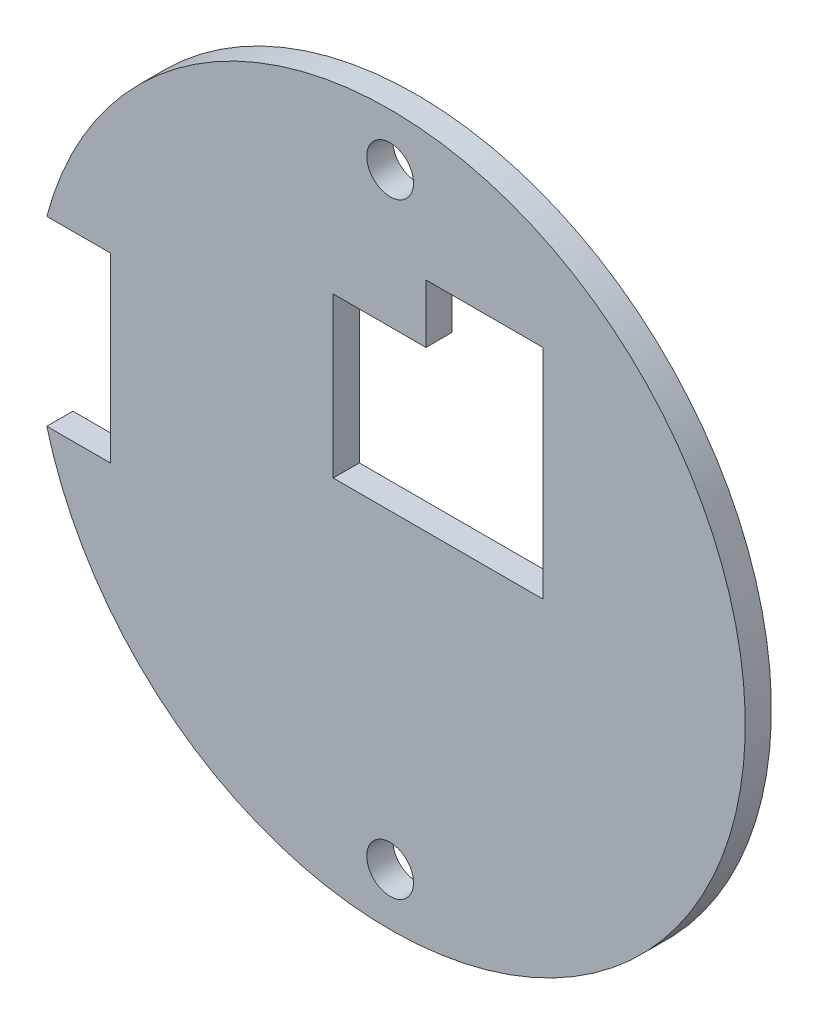
ISO-10303-21;
HEADER;
FILE_DESCRIPTION(('STEP AP214'),'2;1');
FILE_NAME('part.step','',(''),(''),'','','');
FILE_SCHEMA(('AUTOMOTIVE_DESIGN { 1 0 10303 214 1 1 1 1 }'));
ENDSEC;
DATA;
#1=APPLICATION_CONTEXT('core data for automotive mechanical design processes');
#2=APPLICATION_PROTOCOL_DEFINITION('international standard','automotive_design',2000,#1);
#3=PRODUCT_CONTEXT('',#1,'mechanical');
#4=PRODUCT('Part','Part','',(#3));
#5=PRODUCT_RELATED_PRODUCT_CATEGORY('part','',(#4));
#6=PRODUCT_DEFINITION_FORMATION('','',#4);
#7=PRODUCT_DEFINITION_CONTEXT('part definition',#1,'design');
#8=PRODUCT_DEFINITION('design','',#6,#7);
#9=PRODUCT_DEFINITION_SHAPE('','',#8);
#10=(LENGTH_UNIT() NAMED_UNIT(*) SI_UNIT(.MILLI.,.METRE.));
#11=(NAMED_UNIT(*) PLANE_ANGLE_UNIT() SI_UNIT($,.RADIAN.));
#12=(NAMED_UNIT(*) SI_UNIT($,.STERADIAN.) SOLID_ANGLE_UNIT());
#13=UNCERTAINTY_MEASURE_WITH_UNIT(LENGTH_MEASURE(1.E-05),#10,'distance_accuracy_value','');
#14=(GEOMETRIC_REPRESENTATION_CONTEXT(3) GLOBAL_UNCERTAINTY_ASSIGNED_CONTEXT((#13)) GLOBAL_UNIT_ASSIGNED_CONTEXT((#10,
#11,#12)) REPRESENTATION_CONTEXT('',''));
#15=CARTESIAN_POINT('',(0.,0.,0.));
#16=DIRECTION('',(0.,0.,1.));
#17=DIRECTION('',(1.,0.,0.));
#18=AXIS2_PLACEMENT_3D('',#15,#16,#17);
#19=CARTESIAN_POINT('',(0.,0.,1.5875));
#20=DIRECTION('',(0.,0.,1.));
#21=DIRECTION('',(1.,0.,0.));
#22=AXIS2_PLACEMENT_3D('',#19,#20,#21);
#23=PLANE('',#22);
#24=CARTESIAN_POINT('',(0.,-18.415,1.5875));
#25=DIRECTION('',(0.,0.,1.));
#26=DIRECTION('',(1.,0.,0.));
#27=AXIS2_PLACEMENT_3D('',#24,#25,#26);
#28=CIRCLE('',#27,1.4224);
#29=CARTESIAN_POINT('',(1.4224,-18.415,1.5875));
#30=VERTEX_POINT('',#29);
#31=EDGE_CURVE('E144',#30,#30,#28,.T.);
#32=ORIENTED_EDGE('',*,*,#31,.F.);
#33=EDGE_LOOP('',(#32));
#34=FACE_BOUND('',#33,.T.);
#35=DIRECTION('',(0.,-1.,0.));
#36=VECTOR('',#35,1.);
#37=CARTESIAN_POINT('',(-16.9840587441892,5.5245,1.5875));
#38=LINE('',#37,#36);
#39=CARTESIAN_POINT('',(-16.9840587441892,5.5245,1.5875));
#40=VERTEX_POINT('',#39);
#41=CARTESIAN_POINT('',(-16.9840587441892,-5.5245,1.5875));
#42=VERTEX_POINT('',#41);
#43=EDGE_CURVE('E164',#40,#42,#38,.T.);
#44=ORIENTED_EDGE('',*,*,#43,.T.);
#45=DIRECTION('',(-1.,0.,0.));
#46=VECTOR('',#45,1.);
#47=CARTESIAN_POINT('',(-16.9840587441892,-5.5245,1.5875));
#48=LINE('',#47,#46);
#49=CARTESIAN_POINT('',(-20.8712242034338,-5.52449999999999,1.5875));
#50=VERTEX_POINT('',#49);
#51=EDGE_CURVE('E167',#42,#50,#48,.T.);
#52=ORIENTED_EDGE('',*,*,#51,.T.);
#53=CARTESIAN_POINT('',(0.,0.,1.5875));
#54=DIRECTION('',(0.,0.,1.));
#55=DIRECTION('',(1.,0.,0.));
#56=AXIS2_PLACEMENT_3D('',#53,#54,#55);
#57=CIRCLE('',#56,21.59);
#58=CARTESIAN_POINT('',(-20.8712242034338,5.5245,1.5875));
#59=VERTEX_POINT('',#58);
#60=EDGE_CURVE('E170',#50,#59,#57,.T.);
#61=ORIENTED_EDGE('',*,*,#60,.T.);
#62=DIRECTION('',(1.,0.,0.));
#63=VECTOR('',#62,1.);
#64=CARTESIAN_POINT('',(-16.9840587441892,5.5245,1.5875));
#65=LINE('',#64,#63);
#66=EDGE_CURVE('E172',#59,#40,#65,.T.);
#67=ORIENTED_EDGE('',*,*,#66,.T.);
#68=EDGE_LOOP('',(#44,#52,#61,#67));
#69=FACE_BOUND('',#68,.T.);
#70=DIRECTION('',(-1.,0.,0.));
#71=VECTOR('',#70,1.);
#72=CARTESIAN_POINT('',(9.29005,13.7033,1.5875));
#73=LINE('',#72,#71);
#74=CARTESIAN_POINT('',(9.29005,13.7033,1.5875));
#75=VERTEX_POINT('',#74);
#76=CARTESIAN_POINT('',(2.17805,13.7033,1.5875));
#77=VERTEX_POINT('',#76);
#78=EDGE_CURVE('E118',#75,#77,#73,.T.);
#79=ORIENTED_EDGE('',*,*,#78,.F.);
#80=DIRECTION('',(0.,1.,0.));
#81=VECTOR('',#80,1.);
#82=CARTESIAN_POINT('',(9.29005,0.457200000000003,1.5875));
#83=LINE('',#82,#81);
#84=CARTESIAN_POINT('',(9.29005,0.457200000000003,1.5875));
#85=VERTEX_POINT('',#84);
#86=EDGE_CURVE('E110',#85,#75,#83,.T.);
#87=ORIENTED_EDGE('',*,*,#86,.F.);
#88=DIRECTION('',(1.,0.,0.));
#89=VECTOR('',#88,1.);
#90=CARTESIAN_POINT('',(-3.46075,0.457200000000003,1.5875));
#91=LINE('',#90,#89);
#92=CARTESIAN_POINT('',(-3.46075,0.457200000000003,1.5875));
#93=VERTEX_POINT('',#92);
#94=EDGE_CURVE('E141',#93,#85,#91,.T.);
#95=ORIENTED_EDGE('',*,*,#94,.F.);
#96=DIRECTION('',(0.,-1.,0.));
#97=VECTOR('',#96,1.);
#98=CARTESIAN_POINT('',(-3.46075,10.1473,1.5875));
#99=LINE('',#98,#97);
#100=CARTESIAN_POINT('',(-3.46075,10.1473,1.5875));
#101=VERTEX_POINT('',#100);
#102=EDGE_CURVE('E139',#101,#93,#99,.T.);
#103=ORIENTED_EDGE('',*,*,#102,.F.);
#104=DIRECTION('',(-1.,0.,0.));
#105=VECTOR('',#104,1.);
#106=CARTESIAN_POINT('',(2.17805000000001,10.1473,1.5875));
#107=LINE('',#106,#105);
#108=CARTESIAN_POINT('',(2.17805000000001,10.1473,1.5875));
#109=VERTEX_POINT('',#108);
#110=EDGE_CURVE('E134',#109,#101,#107,.T.);
#111=ORIENTED_EDGE('',*,*,#110,.F.);
#112=DIRECTION('',(0.,-1.,0.));
#113=VECTOR('',#112,1.);
#114=CARTESIAN_POINT('',(2.17805,13.7033,1.5875));
#115=LINE('',#114,#113);
#116=EDGE_CURVE('E132',#77,#109,#115,.T.);
#117=ORIENTED_EDGE('',*,*,#116,.F.);
#118=EDGE_LOOP('',(#79,#87,#95,#103,#111,#117));
#119=FACE_BOUND('',#118,.T.);
#120=CARTESIAN_POINT('',(0.,18.415,1.5875));
#121=DIRECTION('',(0.,0.,1.));
#122=DIRECTION('',(1.,0.,0.));
#123=AXIS2_PLACEMENT_3D('',#120,#121,#122);
#124=CIRCLE('',#123,1.4224);
#125=CARTESIAN_POINT('',(1.42240000000001,18.415,1.5875));
#126=VERTEX_POINT('',#125);
#127=EDGE_CURVE('E263',#126,#126,#124,.T.);
#128=ORIENTED_EDGE('',*,*,#127,.F.);
#129=EDGE_LOOP('',(#128));
#130=FACE_BOUND('',#129,.T.);
#131=ADVANCED_FACE('F33',(#34,#69,#119,#130),#23,.T.);
#132=CARTESIAN_POINT('',(0.,0.,0.));
#133=DIRECTION('',(0.,0.,1.));
#134=DIRECTION('',(1.,0.,0.));
#135=AXIS2_PLACEMENT_3D('',#132,#133,#134);
#136=PLANE('',#135);
#137=CARTESIAN_POINT('',(0.,-18.415,0.));
#138=DIRECTION('',(0.,0.,1.));
#139=DIRECTION('',(1.,0.,0.));
#140=AXIS2_PLACEMENT_3D('',#137,#138,#139);
#141=CIRCLE('',#140,1.4224);
#142=CARTESIAN_POINT('',(1.4224,-18.415,0.));
#143=VERTEX_POINT('',#142);
#144=EDGE_CURVE('E269',#143,#143,#141,.T.);
#145=ORIENTED_EDGE('',*,*,#144,.T.);
#146=EDGE_LOOP('',(#145));
#147=FACE_BOUND('',#146,.T.);
#148=DIRECTION('',(0.,-1.,0.));
#149=VECTOR('',#148,1.);
#150=CARTESIAN_POINT('',(-16.9840587441892,5.5245,0.));
#151=LINE('',#150,#149);
#152=CARTESIAN_POINT('',(-16.9840587441892,5.5245,0.));
#153=VERTEX_POINT('',#152);
#154=CARTESIAN_POINT('',(-16.9840587441892,-5.5245,0.));
#155=VERTEX_POINT('',#154);
#156=EDGE_CURVE('E126',#153,#155,#151,.T.);
#157=ORIENTED_EDGE('',*,*,#156,.F.);
#158=DIRECTION('',(1.,0.,0.));
#159=VECTOR('',#158,1.);
#160=CARTESIAN_POINT('',(-16.9840587441892,5.5245,0.));
#161=LINE('',#160,#159);
#162=CARTESIAN_POINT('',(-20.8712242034338,5.5245,0.));
#163=VERTEX_POINT('',#162);
#164=EDGE_CURVE('E168',#163,#153,#161,.T.);
#165=ORIENTED_EDGE('',*,*,#164,.F.);
#166=CARTESIAN_POINT('',(0.,0.,0.));
#167=DIRECTION('',(0.,0.,1.));
#168=DIRECTION('',(1.,0.,0.));
#169=AXIS2_PLACEMENT_3D('',#166,#167,#168);
#170=CIRCLE('',#169,21.59);
#171=CARTESIAN_POINT('',(-20.8712242034338,-5.52449999999999,0.));
#172=VERTEX_POINT('',#171);
#173=EDGE_CURVE('E179',#172,#163,#170,.T.);
#174=ORIENTED_EDGE('',*,*,#173,.F.);
#175=DIRECTION('',(-1.,0.,0.));
#176=VECTOR('',#175,1.);
#177=CARTESIAN_POINT('',(-16.9840587441892,-5.5245,0.));
#178=LINE('',#177,#176);
#179=EDGE_CURVE('E177',#155,#172,#178,.T.);
#180=ORIENTED_EDGE('',*,*,#179,.F.);
#181=EDGE_LOOP('',(#157,#165,#174,#180));
#182=FACE_BOUND('',#181,.T.);
#183=DIRECTION('',(0.,1.,0.));
#184=VECTOR('',#183,1.);
#185=CARTESIAN_POINT('',(9.29005,0.457200000000003,0.));
#186=LINE('',#185,#184);
#187=CARTESIAN_POINT('',(9.29005,0.457200000000003,0.));
#188=VERTEX_POINT('',#187);
#189=CARTESIAN_POINT('',(9.29005,13.7033,0.));
#190=VERTEX_POINT('',#189);
#191=EDGE_CURVE('E56',#188,#190,#186,.T.);
#192=ORIENTED_EDGE('',*,*,#191,.T.);
#193=DIRECTION('',(-1.,0.,0.));
#194=VECTOR('',#193,1.);
#195=CARTESIAN_POINT('',(9.29005,13.7033,0.));
#196=LINE('',#195,#194);
#197=CARTESIAN_POINT('',(2.17805,13.7033,0.));
#198=VERTEX_POINT('',#197);
#199=EDGE_CURVE('E125',#190,#198,#196,.T.);
#200=ORIENTED_EDGE('',*,*,#199,.T.);
#201=DIRECTION('',(0.,-1.,0.));
#202=VECTOR('',#201,1.);
#203=CARTESIAN_POINT('',(2.17805,13.7033,0.));
#204=LINE('',#203,#202);
#205=CARTESIAN_POINT('',(2.17805000000001,10.1473,0.));
#206=VERTEX_POINT('',#205);
#207=EDGE_CURVE('E146',#198,#206,#204,.T.);
#208=ORIENTED_EDGE('',*,*,#207,.T.);
#209=DIRECTION('',(-1.,0.,0.));
#210=VECTOR('',#209,1.);
#211=CARTESIAN_POINT('',(2.17805000000001,10.1473,0.));
#212=LINE('',#211,#210);
#213=CARTESIAN_POINT('',(-3.46075,10.1473,0.));
#214=VERTEX_POINT('',#213);
#215=EDGE_CURVE('E149',#206,#214,#212,.T.);
#216=ORIENTED_EDGE('',*,*,#215,.T.);
#217=DIRECTION('',(0.,-1.,0.));
#218=VECTOR('',#217,1.);
#219=CARTESIAN_POINT('',(-3.46075,10.1473,0.));
#220=LINE('',#219,#218);
#221=CARTESIAN_POINT('',(-3.46075,0.457200000000003,0.));
#222=VERTEX_POINT('',#221);
#223=EDGE_CURVE('E152',#214,#222,#220,.T.);
#224=ORIENTED_EDGE('',*,*,#223,.T.);
#225=DIRECTION('',(1.,0.,0.));
#226=VECTOR('',#225,1.);
#227=CARTESIAN_POINT('',(-3.46075,0.457200000000003,0.));
#228=LINE('',#227,#226);
#229=EDGE_CURVE('E119',#222,#188,#228,.T.);
#230=ORIENTED_EDGE('',*,*,#229,.T.);
#231=EDGE_LOOP('',(#192,#200,#208,#216,#224,#230));
#232=FACE_BOUND('',#231,.T.);
#233=CARTESIAN_POINT('',(0.,18.415,0.));
#234=DIRECTION('',(0.,0.,1.));
#235=DIRECTION('',(1.,0.,0.));
#236=AXIS2_PLACEMENT_3D('',#233,#234,#235);
#237=CIRCLE('',#236,1.4224);
#238=CARTESIAN_POINT('',(1.42240000000001,18.415,0.));
#239=VERTEX_POINT('',#238);
#240=EDGE_CURVE('E266',#239,#239,#237,.T.);
#241=ORIENTED_EDGE('',*,*,#240,.T.);
#242=EDGE_LOOP('',(#241));
#243=FACE_BOUND('',#242,.T.);
#244=ADVANCED_FACE('F197',(#147,#182,#232,#243),#136,.F.);
#245=CARTESIAN_POINT('',(-16.9840587441892,5.5245,1.5875));
#246=DIRECTION('',(1.,0.,0.));
#247=DIRECTION('',(0.,0.,-1.));
#248=AXIS2_PLACEMENT_3D('',#245,#246,#247);
#249=PLANE('',#248);
#250=ORIENTED_EDGE('',*,*,#156,.T.);
#251=DIRECTION('',(0.,0.,-1.));
#252=VECTOR('',#251,1.);
#253=CARTESIAN_POINT('',(-16.9840587441892,-5.5245,1.5875));
#254=LINE('',#253,#252);
#255=EDGE_CURVE('E11',#42,#155,#254,.T.);
#256=ORIENTED_EDGE('',*,*,#255,.F.);
#257=ORIENTED_EDGE('',*,*,#43,.F.);
#258=DIRECTION('',(0.,0.,-1.));
#259=VECTOR('',#258,1.);
#260=CARTESIAN_POINT('',(-16.9840587441892,5.5245,1.5875));
#261=LINE('',#260,#259);
#262=EDGE_CURVE('E174',#40,#153,#261,.T.);
#263=ORIENTED_EDGE('',*,*,#262,.T.);
#264=EDGE_LOOP('',(#250,#256,#257,#263));
#265=FACE_BOUND('',#264,.T.);
#266=ADVANCED_FACE('F35',(#265),#249,.F.);
#267=CARTESIAN_POINT('',(-16.9840587441892,-5.5245,1.5875));
#268=DIRECTION('',(0.,-1.,0.));
#269=DIRECTION('',(1.,0.,0.));
#270=AXIS2_PLACEMENT_3D('',#267,#268,#269);
#271=PLANE('',#270);
#272=ORIENTED_EDGE('',*,*,#179,.T.);
#273=DIRECTION('',(0.,0.,-1.));
#274=VECTOR('',#273,1.);
#275=CARTESIAN_POINT('',(-20.8712242034338,-5.52449999999999,1.5875));
#276=LINE('',#275,#274);
#277=EDGE_CURVE('E41',#50,#172,#276,.T.);
#278=ORIENTED_EDGE('',*,*,#277,.F.);
#279=ORIENTED_EDGE('',*,*,#51,.F.);
#280=ORIENTED_EDGE('',*,*,#255,.T.);
#281=EDGE_LOOP('',(#272,#278,#279,#280));
#282=FACE_BOUND('',#281,.T.);
#283=ADVANCED_FACE('F207',(#282),#271,.F.);
#284=CARTESIAN_POINT('',(0.,0.,1.5875));
#285=DIRECTION('',(0.,0.,-1.));
#286=DIRECTION('',(-1.,0.,0.));
#287=AXIS2_PLACEMENT_3D('',#284,#285,#286);
#288=CYLINDRICAL_SURFACE('',#287,21.59);
#289=ORIENTED_EDGE('',*,*,#173,.T.);
#290=DIRECTION('',(0.,0.,-1.));
#291=VECTOR('',#290,1.);
#292=CARTESIAN_POINT('',(-20.8712242034338,5.5245,1.5875));
#293=LINE('',#292,#291);
#294=EDGE_CURVE('E184',#59,#163,#293,.T.);
#295=ORIENTED_EDGE('',*,*,#294,.F.);
#296=ORIENTED_EDGE('',*,*,#60,.F.);
#297=ORIENTED_EDGE('',*,*,#277,.T.);
#298=EDGE_LOOP('',(#289,#295,#296,#297));
#299=FACE_BOUND('',#298,.T.);
#300=ADVANCED_FACE('F191',(#299),#288,.T.);
#301=CARTESIAN_POINT('',(-16.9840587441892,5.5245,1.5875));
#302=DIRECTION('',(0.,1.,0.));
#303=DIRECTION('',(0.,0.,1.));
#304=AXIS2_PLACEMENT_3D('',#301,#302,#303);
#305=PLANE('',#304);
#306=ORIENTED_EDGE('',*,*,#164,.T.);
#307=ORIENTED_EDGE('',*,*,#262,.F.);
#308=ORIENTED_EDGE('',*,*,#66,.F.);
#309=ORIENTED_EDGE('',*,*,#294,.T.);
#310=EDGE_LOOP('',(#306,#307,#308,#309));
#311=FACE_BOUND('',#310,.T.);
#312=ADVANCED_FACE('F201',(#311),#305,.F.);
#313=CARTESIAN_POINT('',(9.29005,0.457200000000003,1.5875));
#314=DIRECTION('',(-1.,0.,0.));
#315=DIRECTION('',(0.,-1.,0.));
#316=AXIS2_PLACEMENT_3D('',#313,#314,#315);
#317=PLANE('',#316);
#318=ORIENTED_EDGE('',*,*,#191,.F.);
#319=DIRECTION('',(0.,0.,-1.));
#320=VECTOR('',#319,1.);
#321=CARTESIAN_POINT('',(9.29005,0.457200000000003,1.5875));
#322=LINE('',#321,#320);
#323=EDGE_CURVE('E114',#85,#188,#322,.T.);
#324=ORIENTED_EDGE('',*,*,#323,.F.);
#325=ORIENTED_EDGE('',*,*,#86,.T.);
#326=DIRECTION('',(0.,0.,-1.));
#327=VECTOR('',#326,1.);
#328=CARTESIAN_POINT('',(9.29005,13.7033,1.5875));
#329=LINE('',#328,#327);
#330=EDGE_CURVE('E113',#75,#190,#329,.T.);
#331=ORIENTED_EDGE('',*,*,#330,.T.);
#332=EDGE_LOOP('',(#318,#324,#325,#331));
#333=FACE_BOUND('',#332,.T.);
#334=ADVANCED_FACE('F112',(#333),#317,.T.);
#335=CARTESIAN_POINT('',(9.29005,13.7033,1.5875));
#336=DIRECTION('',(0.,-1.,0.));
#337=DIRECTION('',(1.,0.,0.));
#338=AXIS2_PLACEMENT_3D('',#335,#336,#337);
#339=PLANE('',#338);
#340=ORIENTED_EDGE('',*,*,#199,.F.);
#341=ORIENTED_EDGE('',*,*,#330,.F.);
#342=ORIENTED_EDGE('',*,*,#78,.T.);
#343=DIRECTION('',(0.,0.,-1.));
#344=VECTOR('',#343,1.);
#345=CARTESIAN_POINT('',(2.17805,13.7033,1.5875));
#346=LINE('',#345,#344);
#347=EDGE_CURVE('E127',#77,#198,#346,.T.);
#348=ORIENTED_EDGE('',*,*,#347,.T.);
#349=EDGE_LOOP('',(#340,#341,#342,#348));
#350=FACE_BOUND('',#349,.T.);
#351=ADVANCED_FACE('F122',(#350),#339,.T.);
#352=CARTESIAN_POINT('',(2.17805,13.7033,1.5875));
#353=DIRECTION('',(1.,0.,0.));
#354=DIRECTION('',(0.,1.,0.));
#355=AXIS2_PLACEMENT_3D('',#352,#353,#354);
#356=PLANE('',#355);
#357=ORIENTED_EDGE('',*,*,#207,.F.);
#358=ORIENTED_EDGE('',*,*,#347,.F.);
#359=ORIENTED_EDGE('',*,*,#116,.T.);
#360=DIRECTION('',(0.,0.,-1.));
#361=VECTOR('',#360,1.);
#362=CARTESIAN_POINT('',(2.17805000000001,10.1473,1.5875));
#363=LINE('',#362,#361);
#364=EDGE_CURVE('E161',#109,#206,#363,.T.);
#365=ORIENTED_EDGE('',*,*,#364,.T.);
#366=EDGE_LOOP('',(#357,#358,#359,#365));
#367=FACE_BOUND('',#366,.T.);
#368=ADVANCED_FACE('F233',(#367),#356,.T.);
#369=CARTESIAN_POINT('',(2.17805000000001,10.1473,1.5875));
#370=DIRECTION('',(0.,-1.,0.));
#371=DIRECTION('',(0.,0.,-1.));
#372=AXIS2_PLACEMENT_3D('',#369,#370,#371);
#373=PLANE('',#372);
#374=ORIENTED_EDGE('',*,*,#215,.F.);
#375=ORIENTED_EDGE('',*,*,#364,.F.);
#376=ORIENTED_EDGE('',*,*,#110,.T.);
#377=DIRECTION('',(0.,0.,-1.));
#378=VECTOR('',#377,1.);
#379=CARTESIAN_POINT('',(-3.46075,10.1473,1.5875));
#380=LINE('',#379,#378);
#381=EDGE_CURVE('E159',#101,#214,#380,.T.);
#382=ORIENTED_EDGE('',*,*,#381,.T.);
#383=EDGE_LOOP('',(#374,#375,#376,#382));
#384=FACE_BOUND('',#383,.T.);
#385=ADVANCED_FACE('F237',(#384),#373,.T.);
#386=CARTESIAN_POINT('',(-3.46075,10.1473,1.5875));
#387=DIRECTION('',(1.,0.,0.));
#388=DIRECTION('',(0.,1.,0.));
#389=AXIS2_PLACEMENT_3D('',#386,#387,#388);
#390=PLANE('',#389);
#391=ORIENTED_EDGE('',*,*,#223,.F.);
#392=ORIENTED_EDGE('',*,*,#381,.F.);
#393=ORIENTED_EDGE('',*,*,#102,.T.);
#394=DIRECTION('',(0.,0.,-1.));
#395=VECTOR('',#394,1.);
#396=CARTESIAN_POINT('',(-3.46075,0.457200000000003,1.5875));
#397=LINE('',#396,#395);
#398=EDGE_CURVE('E48',#93,#222,#397,.T.);
#399=ORIENTED_EDGE('',*,*,#398,.T.);
#400=EDGE_LOOP('',(#391,#392,#393,#399));
#401=FACE_BOUND('',#400,.T.);
#402=ADVANCED_FACE('F243',(#401),#390,.T.);
#403=CARTESIAN_POINT('',(-3.46075,0.457200000000003,1.5875));
#404=DIRECTION('',(0.,1.,0.));
#405=DIRECTION('',(0.,0.,1.));
#406=AXIS2_PLACEMENT_3D('',#403,#404,#405);
#407=PLANE('',#406);
#408=ORIENTED_EDGE('',*,*,#229,.F.);
#409=ORIENTED_EDGE('',*,*,#398,.F.);
#410=ORIENTED_EDGE('',*,*,#94,.T.);
#411=ORIENTED_EDGE('',*,*,#323,.T.);
#412=EDGE_LOOP('',(#408,#409,#410,#411));
#413=FACE_BOUND('',#412,.T.);
#414=ADVANCED_FACE('F247',(#413),#407,.T.);
#415=CARTESIAN_POINT('',(0.,-18.415,1.5875));
#416=DIRECTION('',(0.,0.,-1.));
#417=DIRECTION('',(-1.,0.,0.));
#418=AXIS2_PLACEMENT_3D('',#415,#416,#417);
#419=CYLINDRICAL_SURFACE('',#418,1.4224);
#420=ORIENTED_EDGE('',*,*,#31,.T.);
#421=EDGE_LOOP('',(#420));
#422=FACE_BOUND('',#421,.T.);
#423=ORIENTED_EDGE('',*,*,#144,.F.);
#424=EDGE_LOOP('',(#423));
#425=FACE_BOUND('',#424,.T.);
#426=ADVANCED_FACE('F251',(#422,#425),#419,.F.);
#427=CARTESIAN_POINT('',(0.,18.415,1.5875));
#428=DIRECTION('',(0.,0.,-1.));
#429=DIRECTION('',(-1.,0.,0.));
#430=AXIS2_PLACEMENT_3D('',#427,#428,#429);
#431=CYLINDRICAL_SURFACE('',#430,1.4224);
#432=ORIENTED_EDGE('',*,*,#127,.T.);
#433=EDGE_LOOP('',(#432));
#434=FACE_BOUND('',#433,.T.);
#435=ORIENTED_EDGE('',*,*,#240,.F.);
#436=EDGE_LOOP('',(#435));
#437=FACE_BOUND('',#436,.T.);
#438=ADVANCED_FACE('F254',(#434,#437),#431,.F.);
#439=CLOSED_SHELL('',(#131,#244,#266,#283,#300,#312,#334,#351,#368,#385,#402,#414,#426,#438));
#440=MANIFOLD_SOLID_BREP('B2',#439);
#441=ADVANCED_BREP_SHAPE_REPRESENTATION('',(#18,#440),#14);
#442=SHAPE_DEFINITION_REPRESENTATION(#9,#441);
ENDSEC;
END-ISO-10303-21;
